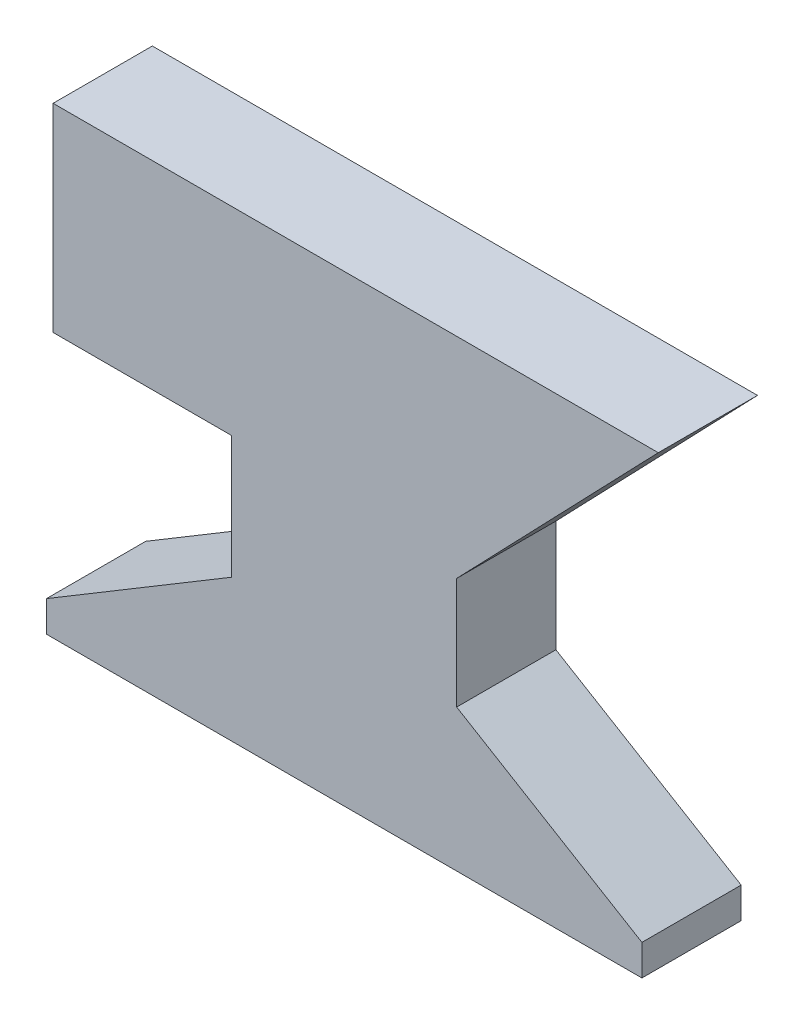
ISO-10303-21;
HEADER;
FILE_DESCRIPTION(('STEP AP214'),'2;1');
FILE_NAME('part.step','',(''),(''),'','','');
FILE_SCHEMA(('AUTOMOTIVE_DESIGN { 1 0 10303 214 1 1 1 1 }'));
ENDSEC;
DATA;
#1=APPLICATION_CONTEXT('core data for automotive mechanical design processes');
#2=APPLICATION_PROTOCOL_DEFINITION('international standard','automotive_design',2000,#1);
#3=PRODUCT_CONTEXT('',#1,'mechanical');
#4=PRODUCT('Part','Part','',(#3));
#5=PRODUCT_RELATED_PRODUCT_CATEGORY('part','',(#4));
#6=PRODUCT_DEFINITION_FORMATION('','',#4);
#7=PRODUCT_DEFINITION_CONTEXT('part definition',#1,'design');
#8=PRODUCT_DEFINITION('design','',#6,#7);
#9=PRODUCT_DEFINITION_SHAPE('','',#8);
#10=(LENGTH_UNIT() NAMED_UNIT(*) SI_UNIT(.MILLI.,.METRE.));
#11=(NAMED_UNIT(*) PLANE_ANGLE_UNIT() SI_UNIT($,.RADIAN.));
#12=(NAMED_UNIT(*) SI_UNIT($,.STERADIAN.) SOLID_ANGLE_UNIT());
#13=UNCERTAINTY_MEASURE_WITH_UNIT(LENGTH_MEASURE(1.E-05),#10,'distance_accuracy_value','');
#14=(GEOMETRIC_REPRESENTATION_CONTEXT(3) GLOBAL_UNCERTAINTY_ASSIGNED_CONTEXT((#13)) GLOBAL_UNIT_ASSIGNED_CONTEXT((#10,
#11,#12)) REPRESENTATION_CONTEXT('',''));
#15=CARTESIAN_POINT('',(0.,0.,0.));
#16=DIRECTION('',(0.,0.,1.));
#17=DIRECTION('',(1.,0.,0.));
#18=AXIS2_PLACEMENT_3D('',#15,#16,#17);
#19=CARTESIAN_POINT('',(-56.1282930687785,0.,5.));
#20=DIRECTION('',(0.,1.,0.));
#21=DIRECTION('',(-1.,0.,0.));
#22=AXIS2_PLACEMENT_3D('',#19,#20,#21);
#23=PLANE('',#22);
#24=DIRECTION('',(1.,0.,0.));
#25=VECTOR('',#24,1.);
#26=CARTESIAN_POINT('',(-56.1282930687785,0.,0.));
#27=LINE('',#26,#25);
#28=CARTESIAN_POINT('',(-101.128293068778,0.,0.));
#29=VERTEX_POINT('',#28);
#30=CARTESIAN_POINT('',(-56.1282930687785,0.,0.));
#31=VERTEX_POINT('',#30);
#32=EDGE_CURVE('E84',#29,#31,#27,.T.);
#33=ORIENTED_EDGE('',*,*,#32,.T.);
#34=DIRECTION('',(0.,0.,-1.));
#35=VECTOR('',#34,1.);
#36=CARTESIAN_POINT('',(-56.1282930687785,0.,5.));
#37=LINE('',#36,#35);
#38=CARTESIAN_POINT('',(-56.1282930687785,0.,5.));
#39=VERTEX_POINT('',#38);
#40=EDGE_CURVE('E12',#39,#31,#37,.T.);
#41=ORIENTED_EDGE('',*,*,#40,.F.);
#42=DIRECTION('',(1.,0.,0.));
#43=VECTOR('',#42,1.);
#44=CARTESIAN_POINT('',(-56.1282930687785,0.,5.));
#45=LINE('',#44,#43);
#46=CARTESIAN_POINT('',(-101.128293068778,0.,5.));
#47=VERTEX_POINT('',#46);
#48=EDGE_CURVE('E53',#47,#39,#45,.T.);
#49=ORIENTED_EDGE('',*,*,#48,.F.);
#50=DIRECTION('',(0.,0.,-1.));
#51=VECTOR('',#50,1.);
#52=CARTESIAN_POINT('',(-101.128293068778,0.,5.));
#53=LINE('',#52,#51);
#54=EDGE_CURVE('E45',#47,#29,#53,.T.);
#55=ORIENTED_EDGE('',*,*,#54,.T.);
#56=EDGE_LOOP('',(#33,#41,#49,#55));
#57=FACE_BOUND('',#56,.T.);
#58=ADVANCED_FACE('F37',(#57),#23,.F.);
#59=CARTESIAN_POINT('',(0.,0.,5.));
#60=DIRECTION('',(0.,0.,-1.));
#61=DIRECTION('',(-1.,0.,0.));
#62=AXIS2_PLACEMENT_3D('',#59,#60,#61);
#63=PLANE('',#62);
#64=DIRECTION('',(0.,1.,0.));
#65=VECTOR('',#64,1.);
#66=CARTESIAN_POINT('',(-101.128293068778,0.,5.));
#67=LINE('',#66,#65);
#68=CARTESIAN_POINT('',(-101.128293068778,2.33238075793813,5.));
#69=VERTEX_POINT('',#68);
#70=EDGE_CURVE('E111',#47,#69,#67,.T.);
#71=ORIENTED_EDGE('',*,*,#70,.F.);
#72=ORIENTED_EDGE('',*,*,#48,.T.);
#73=DIRECTION('',(0.,-1.,0.));
#74=VECTOR('',#73,1.);
#75=CARTESIAN_POINT('',(-56.1282930687785,2.33238075793813,5.));
#76=LINE('',#75,#74);
#77=CARTESIAN_POINT('',(-56.1282930687785,2.33238075793813,5.));
#78=VERTEX_POINT('',#77);
#79=EDGE_CURVE('E153',#78,#39,#76,.T.);
#80=ORIENTED_EDGE('',*,*,#79,.F.);
#81=DIRECTION('',(0.857492925712544,-0.514495755427527,0.));
#82=VECTOR('',#81,1.);
#83=CARTESIAN_POINT('',(-70.1282930687784,10.7323807579381,5.));
#84=LINE('',#83,#82);
#85=CARTESIAN_POINT('',(-70.1282930687784,10.7323807579381,5.));
#86=VERTEX_POINT('',#85);
#87=EDGE_CURVE('E149',#86,#78,#84,.T.);
#88=ORIENTED_EDGE('',*,*,#87,.F.);
#89=DIRECTION('',(0.,-1.,0.));
#90=VECTOR('',#89,1.);
#91=CARTESIAN_POINT('',(-70.1282930687784,19.1544497925006,5.));
#92=LINE('',#91,#90);
#93=CARTESIAN_POINT('',(-70.1282930687784,19.1544497925006,5.));
#94=VERTEX_POINT('',#93);
#95=EDGE_CURVE('E145',#94,#86,#92,.T.);
#96=ORIENTED_EDGE('',*,*,#95,.F.);
#97=DIRECTION('',(-0.693108716251785,-0.720833064901856,0.));
#98=VECTOR('',#97,1.);
#99=CARTESIAN_POINT('',(-54.892187100029,35.,5.));
#100=LINE('',#99,#98);
#101=CARTESIAN_POINT('',(-54.892187100029,35.,5.));
#102=VERTEX_POINT('',#101);
#103=EDGE_CURVE('E141',#102,#94,#100,.T.);
#104=ORIENTED_EDGE('',*,*,#103,.F.);
#105=DIRECTION('',(1.,0.,0.));
#106=VECTOR('',#105,1.);
#107=CARTESIAN_POINT('',(-54.892187100029,35.,5.));
#108=LINE('',#107,#106);
#109=CARTESIAN_POINT('',(-100.628293068778,35.,5.));
#110=VERTEX_POINT('',#109);
#111=EDGE_CURVE('E137',#110,#102,#108,.T.);
#112=ORIENTED_EDGE('',*,*,#111,.F.);
#113=DIRECTION('',(0.,1.,0.));
#114=VECTOR('',#113,1.);
#115=CARTESIAN_POINT('',(-100.628293068778,35.,5.));
#116=LINE('',#115,#114);
#117=CARTESIAN_POINT('',(-100.628293068778,20.,5.));
#118=VERTEX_POINT('',#117);
#119=EDGE_CURVE('E133',#118,#110,#116,.T.);
#120=ORIENTED_EDGE('',*,*,#119,.F.);
#121=DIRECTION('',(-1.,0.,0.));
#122=VECTOR('',#121,1.);
#123=CARTESIAN_POINT('',(-87.1282930687785,20.,5.));
#124=LINE('',#123,#122);
#125=CARTESIAN_POINT('',(-87.1282930687785,20.,5.));
#126=VERTEX_POINT('',#125);
#127=EDGE_CURVE('E129',#126,#118,#124,.T.);
#128=ORIENTED_EDGE('',*,*,#127,.F.);
#129=DIRECTION('',(0.,1.,0.));
#130=VECTOR('',#129,1.);
#131=CARTESIAN_POINT('',(-87.1282930687785,10.7323807579381,5.));
#132=LINE('',#131,#130);
#133=CARTESIAN_POINT('',(-87.1282930687785,10.7323807579381,5.));
#134=VERTEX_POINT('',#133);
#135=EDGE_CURVE('E125',#134,#126,#132,.T.);
#136=ORIENTED_EDGE('',*,*,#135,.F.);
#137=DIRECTION('',(0.857492925712544,0.514495755427527,0.));
#138=VECTOR('',#137,1.);
#139=CARTESIAN_POINT('',(-101.128293068778,2.33238075793813,5.));
#140=LINE('',#139,#138);
#141=EDGE_CURVE('E121',#69,#134,#140,.T.);
#142=ORIENTED_EDGE('',*,*,#141,.F.);
#143=EDGE_LOOP('',(#71,#72,#80,#88,#96,#104,#112,#120,#128,#136,#142));
#144=FACE_BOUND('',#143,.T.);
#145=ADVANCED_FACE('F280',(#144),#63,.F.);
#146=CARTESIAN_POINT('',(0.,0.,0.));
#147=DIRECTION('',(0.,0.,-1.));
#148=DIRECTION('',(-1.,0.,0.));
#149=AXIS2_PLACEMENT_3D('',#146,#147,#148);
#150=PLANE('',#149);
#151=ORIENTED_EDGE('',*,*,#32,.F.);
#152=DIRECTION('',(-0.857492925712544,-0.514495755427527,0.));
#153=VECTOR('',#152,1.);
#154=CARTESIAN_POINT('',(-101.128293068778,0.,0.));
#155=LINE('',#154,#153);
#156=CARTESIAN_POINT('',(-86.1282930687785,9.00000000000001,0.));
#157=VERTEX_POINT('',#156);
#158=EDGE_CURVE('E81',#157,#29,#155,.T.);
#159=ORIENTED_EDGE('',*,*,#158,.F.);
#160=DIRECTION('',(0.,-1.,0.));
#161=VECTOR('',#160,1.);
#162=CARTESIAN_POINT('',(-86.1282930687785,9.00000000000001,0.));
#163=LINE('',#162,#161);
#164=CARTESIAN_POINT('',(-86.1282930687785,21.,0.));
#165=VERTEX_POINT('',#164);
#166=EDGE_CURVE('E104',#165,#157,#163,.T.);
#167=ORIENTED_EDGE('',*,*,#166,.F.);
#168=DIRECTION('',(1.,0.,0.));
#169=VECTOR('',#168,1.);
#170=CARTESIAN_POINT('',(-86.1282930687785,21.,0.));
#171=LINE('',#170,#169);
#172=CARTESIAN_POINT('',(-98.6282930687785,21.,0.));
#173=VERTEX_POINT('',#172);
#174=EDGE_CURVE('E182',#173,#165,#171,.T.);
#175=ORIENTED_EDGE('',*,*,#174,.F.);
#176=DIRECTION('',(0.,-1.,0.));
#177=VECTOR('',#176,1.);
#178=CARTESIAN_POINT('',(-98.6282930687785,21.,0.));
#179=LINE('',#178,#177);
#180=CARTESIAN_POINT('',(-98.6282930687785,34.,0.));
#181=VERTEX_POINT('',#180);
#182=EDGE_CURVE('E179',#181,#173,#179,.T.);
#183=ORIENTED_EDGE('',*,*,#182,.F.);
#184=DIRECTION('',(-1.,0.,0.));
#185=VECTOR('',#184,1.);
#186=CARTESIAN_POINT('',(-98.6282930687785,34.,0.));
#187=LINE('',#186,#185);
#188=CARTESIAN_POINT('',(-58.6282930687785,34.,0.));
#189=VERTEX_POINT('',#188);
#190=EDGE_CURVE('E176',#189,#181,#187,.T.);
#191=ORIENTED_EDGE('',*,*,#190,.F.);
#192=DIRECTION('',(0.693108716251785,0.720833064901856,0.));
#193=VECTOR('',#192,1.);
#194=CARTESIAN_POINT('',(-58.6282930687785,34.,0.));
#195=LINE('',#194,#193);
#196=CARTESIAN_POINT('',(-71.1282930687785,21.,0.));
#197=VERTEX_POINT('',#196);
#198=EDGE_CURVE('E173',#197,#189,#195,.T.);
#199=ORIENTED_EDGE('',*,*,#198,.F.);
#200=DIRECTION('',(0.,1.,0.));
#201=VECTOR('',#200,1.);
#202=CARTESIAN_POINT('',(-71.1282930687785,21.,0.));
#203=LINE('',#202,#201);
#204=CARTESIAN_POINT('',(-71.1282930687784,9.00000000000001,0.));
#205=VERTEX_POINT('',#204);
#206=EDGE_CURVE('E170',#205,#197,#203,.T.);
#207=ORIENTED_EDGE('',*,*,#206,.F.);
#208=DIRECTION('',(-0.857492925712544,0.514495755427527,0.));
#209=VECTOR('',#208,1.);
#210=CARTESIAN_POINT('',(-71.1282930687784,9.00000000000001,0.));
#211=LINE('',#210,#209);
#212=EDGE_CURVE('E91',#31,#205,#211,.T.);
#213=ORIENTED_EDGE('',*,*,#212,.F.);
#214=EDGE_LOOP('',(#151,#159,#167,#175,#183,#191,#199,#207,#213));
#215=FACE_BOUND('',#214,.T.);
#216=ADVANCED_FACE('F89',(#215),#150,.T.);
#217=CARTESIAN_POINT('',(-58.6282930687785,34.,-62.9894602074673));
#218=DIRECTION('',(0.,1.,0.));
#219=DIRECTION('',(0.,0.,1.));
#220=AXIS2_PLACEMENT_3D('',#217,#218,#219);
#221=PLANE('',#220);
#222=ORIENTED_EDGE('',*,*,#190,.T.);
#223=DIRECTION('',(0.,0.,1.));
#224=VECTOR('',#223,1.);
#225=CARTESIAN_POINT('',(-98.6282930687785,34.,-62.9894602074673));
#226=LINE('',#225,#224);
#227=CARTESIAN_POINT('',(-98.6282930687785,34.,-2.50000000000002));
#228=VERTEX_POINT('',#227);
#229=EDGE_CURVE('E167',#228,#181,#226,.T.);
#230=ORIENTED_EDGE('',*,*,#229,.F.);
#231=DIRECTION('',(-1.,0.,0.));
#232=VECTOR('',#231,1.);
#233=CARTESIAN_POINT('',(-58.6282930687785,34.,-2.5));
#234=LINE('',#233,#232);
#235=CARTESIAN_POINT('',(-58.6282930687785,34.,-2.5));
#236=VERTEX_POINT('',#235);
#237=EDGE_CURVE('E211',#236,#228,#234,.T.);
#238=ORIENTED_EDGE('',*,*,#237,.F.);
#239=DIRECTION('',(0.,0.,1.));
#240=VECTOR('',#239,1.);
#241=CARTESIAN_POINT('',(-58.6282930687785,34.,-62.9894602074673));
#242=LINE('',#241,#240);
#243=EDGE_CURVE('E164',#236,#189,#242,.T.);
#244=ORIENTED_EDGE('',*,*,#243,.T.);
#245=EDGE_LOOP('',(#222,#230,#238,#244));
#246=FACE_BOUND('',#245,.T.);
#247=ADVANCED_FACE('F326',(#246),#221,.F.);
#248=CARTESIAN_POINT('',(-98.6282930687785,34.,-62.9894602074673));
#249=DIRECTION('',(-1.,0.,0.));
#250=DIRECTION('',(0.,0.,1.));
#251=AXIS2_PLACEMENT_3D('',#248,#249,#250);
#252=PLANE('',#251);
#253=ORIENTED_EDGE('',*,*,#182,.T.);
#254=DIRECTION('',(0.,0.,1.));
#255=VECTOR('',#254,1.);
#256=CARTESIAN_POINT('',(-98.6282930687785,21.,-62.9894602074673));
#257=LINE('',#256,#255);
#258=CARTESIAN_POINT('',(-98.6282930687785,21.,-2.50000000000002));
#259=VERTEX_POINT('',#258);
#260=EDGE_CURVE('E199',#259,#173,#257,.T.);
#261=ORIENTED_EDGE('',*,*,#260,.F.);
#262=DIRECTION('',(0.,-1.,0.));
#263=VECTOR('',#262,1.);
#264=CARTESIAN_POINT('',(-98.6282930687785,34.,-2.5));
#265=LINE('',#264,#263);
#266=EDGE_CURVE('E214',#228,#259,#265,.T.);
#267=ORIENTED_EDGE('',*,*,#266,.F.);
#268=ORIENTED_EDGE('',*,*,#229,.T.);
#269=EDGE_LOOP('',(#253,#261,#267,#268));
#270=FACE_BOUND('',#269,.T.);
#271=ADVANCED_FACE('F382',(#270),#252,.F.);
#272=CARTESIAN_POINT('',(-98.6282930687785,21.,-62.9894602074673));
#273=DIRECTION('',(0.,-1.,0.));
#274=DIRECTION('',(1.,0.,0.));
#275=AXIS2_PLACEMENT_3D('',#272,#273,#274);
#276=PLANE('',#275);
#277=ORIENTED_EDGE('',*,*,#174,.T.);
#278=DIRECTION('',(0.,0.,1.));
#279=VECTOR('',#278,1.);
#280=CARTESIAN_POINT('',(-86.1282930687785,21.,-62.9894602074673));
#281=LINE('',#280,#279);
#282=CARTESIAN_POINT('',(-86.1282930687785,21.,-2.50000000000002));
#283=VERTEX_POINT('',#282);
#284=EDGE_CURVE('E115',#283,#165,#281,.T.);
#285=ORIENTED_EDGE('',*,*,#284,.F.);
#286=DIRECTION('',(1.,0.,0.));
#287=VECTOR('',#286,1.);
#288=CARTESIAN_POINT('',(-98.6282930687785,21.,-2.5));
#289=LINE('',#288,#287);
#290=EDGE_CURVE('E201',#259,#283,#289,.T.);
#291=ORIENTED_EDGE('',*,*,#290,.F.);
#292=ORIENTED_EDGE('',*,*,#260,.T.);
#293=EDGE_LOOP('',(#277,#285,#291,#292));
#294=FACE_BOUND('',#293,.T.);
#295=ADVANCED_FACE('F194',(#294),#276,.F.);
#296=CARTESIAN_POINT('',(-86.1282930687785,21.,-62.9894602074673));
#297=DIRECTION('',(-1.,0.,0.));
#298=DIRECTION('',(0.,-1.,0.));
#299=AXIS2_PLACEMENT_3D('',#296,#297,#298);
#300=PLANE('',#299);
#301=ORIENTED_EDGE('',*,*,#166,.T.);
#302=DIRECTION('',(0.,0.,1.));
#303=VECTOR('',#302,1.);
#304=CARTESIAN_POINT('',(-86.1282930687785,9.00000000000001,-62.9894602074673));
#305=LINE('',#304,#303);
#306=CARTESIAN_POINT('',(-86.1282930687785,9.00000000000001,-2.50000000000002));
#307=VERTEX_POINT('',#306);
#308=EDGE_CURVE('E103',#307,#157,#305,.T.);
#309=ORIENTED_EDGE('',*,*,#308,.F.);
#310=DIRECTION('',(0.,-1.,0.));
#311=VECTOR('',#310,1.);
#312=CARTESIAN_POINT('',(-86.1282930687785,21.,-2.5));
#313=LINE('',#312,#311);
#314=EDGE_CURVE('E217',#283,#307,#313,.T.);
#315=ORIENTED_EDGE('',*,*,#314,.F.);
#316=ORIENTED_EDGE('',*,*,#284,.T.);
#317=EDGE_LOOP('',(#301,#309,#315,#316));
#318=FACE_BOUND('',#317,.T.);
#319=ADVANCED_FACE('F187',(#318),#300,.F.);
#320=CARTESIAN_POINT('',(-86.1282930687785,9.00000000000001,-62.9894602074673));
#321=DIRECTION('',(-0.514495755427527,0.857492925712544,0.));
#322=DIRECTION('',(-0.857492925712544,-0.514495755427527,0.));
#323=AXIS2_PLACEMENT_3D('',#320,#321,#322);
#324=PLANE('',#323);
#325=ORIENTED_EDGE('',*,*,#158,.T.);
#326=DIRECTION('',(0.,0.,1.));
#327=VECTOR('',#326,1.);
#328=CARTESIAN_POINT('',(-101.128293068778,0.,-62.9894602074673));
#329=LINE('',#328,#327);
#330=CARTESIAN_POINT('',(-101.128293068778,0.,-2.50000000000002));
#331=VERTEX_POINT('',#330);
#332=EDGE_CURVE('E100',#331,#29,#329,.T.);
#333=ORIENTED_EDGE('',*,*,#332,.F.);
#334=DIRECTION('',(-0.857492925712544,-0.514495755427527,0.));
#335=VECTOR('',#334,1.);
#336=CARTESIAN_POINT('',(-86.1282930687785,9.00000000000001,-2.5));
#337=LINE('',#336,#335);
#338=EDGE_CURVE('E219',#307,#331,#337,.T.);
#339=ORIENTED_EDGE('',*,*,#338,.F.);
#340=ORIENTED_EDGE('',*,*,#308,.T.);
#341=EDGE_LOOP('',(#325,#333,#339,#340));
#342=FACE_BOUND('',#341,.T.);
#343=ADVANCED_FACE('F97',(#342),#324,.F.);
#344=CARTESIAN_POINT('',(-101.128293068778,0.,-62.9894602074673));
#345=DIRECTION('',(1.,0.,0.));
#346=DIRECTION('',(0.,0.,-1.));
#347=AXIS2_PLACEMENT_3D('',#344,#345,#346);
#348=PLANE('',#347);
#349=DIRECTION('',(0.,1.,0.));
#350=VECTOR('',#349,1.);
#351=CARTESIAN_POINT('',(-101.128293068778,0.,-2.5));
#352=LINE('',#351,#350);
#353=CARTESIAN_POINT('',(-101.128293068778,2.33238075793813,-2.50000000000002));
#354=VERTEX_POINT('',#353);
#355=EDGE_CURVE('E110',#331,#354,#352,.T.);
#356=ORIENTED_EDGE('',*,*,#355,.F.);
#357=ORIENTED_EDGE('',*,*,#332,.T.);
#358=ORIENTED_EDGE('',*,*,#54,.F.);
#359=ORIENTED_EDGE('',*,*,#70,.T.);
#360=DIRECTION('',(0.,0.,1.));
#361=VECTOR('',#360,1.);
#362=CARTESIAN_POINT('',(-101.128293068778,2.33238075793813,-62.9894602074673));
#363=LINE('',#362,#361);
#364=EDGE_CURVE('E113',#354,#69,#363,.T.);
#365=ORIENTED_EDGE('',*,*,#364,.F.);
#366=EDGE_LOOP('',(#356,#357,#358,#359,#365));
#367=FACE_BOUND('',#366,.T.);
#368=ADVANCED_FACE('F107',(#367),#348,.F.);
#369=CARTESIAN_POINT('',(-101.128293068778,2.33238075793813,-62.9894602074673));
#370=DIRECTION('',(0.514495755427527,-0.857492925712544,0.));
#371=DIRECTION('',(0.857492925712544,0.514495755427527,0.));
#372=AXIS2_PLACEMENT_3D('',#369,#370,#371);
#373=PLANE('',#372);
#374=DIRECTION('',(0.857492925712544,0.514495755427527,0.));
#375=VECTOR('',#374,1.);
#376=CARTESIAN_POINT('',(-101.128293068778,2.33238075793813,-2.5));
#377=LINE('',#376,#375);
#378=CARTESIAN_POINT('',(-87.1282930687785,10.7323807579381,-2.50000000000002));
#379=VERTEX_POINT('',#378);
#380=EDGE_CURVE('E222',#354,#379,#377,.T.);
#381=ORIENTED_EDGE('',*,*,#380,.F.);
#382=ORIENTED_EDGE('',*,*,#364,.T.);
#383=ORIENTED_EDGE('',*,*,#141,.T.);
#384=DIRECTION('',(0.,0.,1.));
#385=VECTOR('',#384,1.);
#386=CARTESIAN_POINT('',(-87.1282930687785,10.7323807579381,-62.9894602074673));
#387=LINE('',#386,#385);
#388=EDGE_CURVE('E122',#379,#134,#387,.T.);
#389=ORIENTED_EDGE('',*,*,#388,.F.);
#390=EDGE_LOOP('',(#381,#382,#383,#389));
#391=FACE_BOUND('',#390,.T.);
#392=ADVANCED_FACE('F381',(#391),#373,.F.);
#393=CARTESIAN_POINT('',(-87.1282930687785,10.7323807579381,-62.9894602074673));
#394=DIRECTION('',(1.,0.,0.));
#395=DIRECTION('',(0.,0.,-1.));
#396=AXIS2_PLACEMENT_3D('',#393,#394,#395);
#397=PLANE('',#396);
#398=DIRECTION('',(0.,1.,0.));
#399=VECTOR('',#398,1.);
#400=CARTESIAN_POINT('',(-87.1282930687785,10.7323807579381,-2.5));
#401=LINE('',#400,#399);
#402=CARTESIAN_POINT('',(-87.1282930687785,20.,-2.50000000000002));
#403=VERTEX_POINT('',#402);
#404=EDGE_CURVE('E225',#379,#403,#401,.T.);
#405=ORIENTED_EDGE('',*,*,#404,.F.);
#406=ORIENTED_EDGE('',*,*,#388,.T.);
#407=ORIENTED_EDGE('',*,*,#135,.T.);
#408=DIRECTION('',(0.,0.,1.));
#409=VECTOR('',#408,1.);
#410=CARTESIAN_POINT('',(-87.1282930687785,20.,-62.9894602074673));
#411=LINE('',#410,#409);
#412=EDGE_CURVE('E126',#403,#126,#411,.T.);
#413=ORIENTED_EDGE('',*,*,#412,.F.);
#414=EDGE_LOOP('',(#405,#406,#407,#413));
#415=FACE_BOUND('',#414,.T.);
#416=ADVANCED_FACE('F377',(#415),#397,.F.);
#417=CARTESIAN_POINT('',(-87.1282930687785,20.,-62.9894602074673));
#418=DIRECTION('',(0.,1.,0.));
#419=DIRECTION('',(0.,0.,1.));
#420=AXIS2_PLACEMENT_3D('',#417,#418,#419);
#421=PLANE('',#420);
#422=DIRECTION('',(-1.,0.,0.));
#423=VECTOR('',#422,1.);
#424=CARTESIAN_POINT('',(-87.1282930687785,20.,-2.5));
#425=LINE('',#424,#423);
#426=CARTESIAN_POINT('',(-100.628293068778,20.,-2.50000000000002));
#427=VERTEX_POINT('',#426);
#428=EDGE_CURVE('E228',#403,#427,#425,.T.);
#429=ORIENTED_EDGE('',*,*,#428,.F.);
#430=ORIENTED_EDGE('',*,*,#412,.T.);
#431=ORIENTED_EDGE('',*,*,#127,.T.);
#432=DIRECTION('',(0.,0.,1.));
#433=VECTOR('',#432,1.);
#434=CARTESIAN_POINT('',(-100.628293068778,20.,-62.9894602074673));
#435=LINE('',#434,#433);
#436=EDGE_CURVE('E130',#427,#118,#435,.T.);
#437=ORIENTED_EDGE('',*,*,#436,.F.);
#438=EDGE_LOOP('',(#429,#430,#431,#437));
#439=FACE_BOUND('',#438,.T.);
#440=ADVANCED_FACE('F374',(#439),#421,.F.);
#441=CARTESIAN_POINT('',(-100.628293068778,35.,-62.9894602074673));
#442=DIRECTION('',(1.,0.,0.));
#443=DIRECTION('',(0.,0.,-1.));
#444=AXIS2_PLACEMENT_3D('',#441,#442,#443);
#445=PLANE('',#444);
#446=DIRECTION('',(0.,1.,0.));
#447=VECTOR('',#446,1.);
#448=CARTESIAN_POINT('',(-100.628293068778,35.,-2.5));
#449=LINE('',#448,#447);
#450=CARTESIAN_POINT('',(-100.628293068778,35.,-2.50000000000002));
#451=VERTEX_POINT('',#450);
#452=EDGE_CURVE('E231',#427,#451,#449,.T.);
#453=ORIENTED_EDGE('',*,*,#452,.F.);
#454=ORIENTED_EDGE('',*,*,#436,.T.);
#455=ORIENTED_EDGE('',*,*,#119,.T.);
#456=DIRECTION('',(0.,0.,1.));
#457=VECTOR('',#456,1.);
#458=CARTESIAN_POINT('',(-100.628293068778,35.,-62.9894602074673));
#459=LINE('',#458,#457);
#460=EDGE_CURVE('E134',#451,#110,#459,.T.);
#461=ORIENTED_EDGE('',*,*,#460,.F.);
#462=EDGE_LOOP('',(#453,#454,#455,#461));
#463=FACE_BOUND('',#462,.T.);
#464=ADVANCED_FACE('F425',(#463),#445,.F.);
#465=CARTESIAN_POINT('',(-54.892187100029,35.,-62.9894602074673));
#466=DIRECTION('',(0.,-1.,0.));
#467=DIRECTION('',(0.,0.,-1.));
#468=AXIS2_PLACEMENT_3D('',#465,#466,#467);
#469=PLANE('',#468);
#470=DIRECTION('',(1.,0.,0.));
#471=VECTOR('',#470,1.);
#472=CARTESIAN_POINT('',(-54.892187100029,35.,-2.5));
#473=LINE('',#472,#471);
#474=CARTESIAN_POINT('',(-54.892187100029,35.,-2.50000000000002));
#475=VERTEX_POINT('',#474);
#476=EDGE_CURVE('E234',#451,#475,#473,.T.);
#477=ORIENTED_EDGE('',*,*,#476,.F.);
#478=ORIENTED_EDGE('',*,*,#460,.T.);
#479=ORIENTED_EDGE('',*,*,#111,.T.);
#480=DIRECTION('',(0.,0.,1.));
#481=VECTOR('',#480,1.);
#482=CARTESIAN_POINT('',(-54.892187100029,35.,-62.9894602074673));
#483=LINE('',#482,#481);
#484=EDGE_CURVE('E138',#475,#102,#483,.T.);
#485=ORIENTED_EDGE('',*,*,#484,.F.);
#486=EDGE_LOOP('',(#477,#478,#479,#485));
#487=FACE_BOUND('',#486,.T.);
#488=ADVANCED_FACE('F364',(#487),#469,.F.);
#489=CARTESIAN_POINT('',(-54.892187100029,35.,-62.9894602074673));
#490=DIRECTION('',(-0.720833064901856,0.693108716251785,0.));
#491=DIRECTION('',(-0.693108716251785,-0.720833064901856,0.));
#492=AXIS2_PLACEMENT_3D('',#489,#490,#491);
#493=PLANE('',#492);
#494=DIRECTION('',(-0.693108716251785,-0.720833064901856,0.));
#495=VECTOR('',#494,1.);
#496=CARTESIAN_POINT('',(-54.892187100029,35.,-2.5));
#497=LINE('',#496,#495);
#498=CARTESIAN_POINT('',(-70.1282930687784,19.1544497925006,-2.50000000000002));
#499=VERTEX_POINT('',#498);
#500=EDGE_CURVE('E237',#475,#499,#497,.T.);
#501=ORIENTED_EDGE('',*,*,#500,.F.);
#502=ORIENTED_EDGE('',*,*,#484,.T.);
#503=ORIENTED_EDGE('',*,*,#103,.T.);
#504=DIRECTION('',(0.,0.,1.));
#505=VECTOR('',#504,1.);
#506=CARTESIAN_POINT('',(-70.1282930687784,19.1544497925006,-62.9894602074673));
#507=LINE('',#506,#505);
#508=EDGE_CURVE('E142',#499,#94,#507,.T.);
#509=ORIENTED_EDGE('',*,*,#508,.F.);
#510=EDGE_LOOP('',(#501,#502,#503,#509));
#511=FACE_BOUND('',#510,.T.);
#512=ADVANCED_FACE('F362',(#511),#493,.F.);
#513=CARTESIAN_POINT('',(-70.1282930687784,19.1544497925006,-62.9894602074673));
#514=DIRECTION('',(-1.,0.,0.));
#515=DIRECTION('',(0.,0.,1.));
#516=AXIS2_PLACEMENT_3D('',#513,#514,#515);
#517=PLANE('',#516);
#518=DIRECTION('',(0.,-1.,0.));
#519=VECTOR('',#518,1.);
#520=CARTESIAN_POINT('',(-70.1282930687784,19.1544497925006,-2.5));
#521=LINE('',#520,#519);
#522=CARTESIAN_POINT('',(-70.1282930687784,10.7323807579381,-2.50000000000002));
#523=VERTEX_POINT('',#522);
#524=EDGE_CURVE('E240',#499,#523,#521,.T.);
#525=ORIENTED_EDGE('',*,*,#524,.F.);
#526=ORIENTED_EDGE('',*,*,#508,.T.);
#527=ORIENTED_EDGE('',*,*,#95,.T.);
#528=DIRECTION('',(0.,0.,1.));
#529=VECTOR('',#528,1.);
#530=CARTESIAN_POINT('',(-70.1282930687784,10.7323807579381,-62.9894602074673));
#531=LINE('',#530,#529);
#532=EDGE_CURVE('E146',#523,#86,#531,.T.);
#533=ORIENTED_EDGE('',*,*,#532,.F.);
#534=EDGE_LOOP('',(#525,#526,#527,#533));
#535=FACE_BOUND('',#534,.T.);
#536=ADVANCED_FACE('F358',(#535),#517,.F.);
#537=CARTESIAN_POINT('',(-70.1282930687784,10.7323807579381,-62.9894602074673));
#538=DIRECTION('',(-0.514495755427527,-0.857492925712544,0.));
#539=DIRECTION('',(0.857492925712544,-0.514495755427527,0.));
#540=AXIS2_PLACEMENT_3D('',#537,#538,#539);
#541=PLANE('',#540);
#542=DIRECTION('',(0.857492925712544,-0.514495755427527,0.));
#543=VECTOR('',#542,1.);
#544=CARTESIAN_POINT('',(-70.1282930687784,10.7323807579381,-2.5));
#545=LINE('',#544,#543);
#546=CARTESIAN_POINT('',(-56.1282930687785,2.33238075793813,-2.50000000000002));
#547=VERTEX_POINT('',#546);
#548=EDGE_CURVE('E243',#523,#547,#545,.T.);
#549=ORIENTED_EDGE('',*,*,#548,.F.);
#550=ORIENTED_EDGE('',*,*,#532,.T.);
#551=ORIENTED_EDGE('',*,*,#87,.T.);
#552=DIRECTION('',(0.,0.,1.));
#553=VECTOR('',#552,1.);
#554=CARTESIAN_POINT('',(-56.1282930687785,2.33238075793813,-62.9894602074673));
#555=LINE('',#554,#553);
#556=EDGE_CURVE('E150',#547,#78,#555,.T.);
#557=ORIENTED_EDGE('',*,*,#556,.F.);
#558=EDGE_LOOP('',(#549,#550,#551,#557));
#559=FACE_BOUND('',#558,.T.);
#560=ADVANCED_FACE('F356',(#559),#541,.F.);
#561=CARTESIAN_POINT('',(-56.1282930687785,2.33238075793813,-62.9894602074673));
#562=DIRECTION('',(-1.,0.,0.));
#563=DIRECTION('',(0.,0.,1.));
#564=AXIS2_PLACEMENT_3D('',#561,#562,#563);
#565=PLANE('',#564);
#566=DIRECTION('',(0.,-1.,0.));
#567=VECTOR('',#566,1.);
#568=CARTESIAN_POINT('',(-56.1282930687785,2.33238075793813,-2.5));
#569=LINE('',#568,#567);
#570=CARTESIAN_POINT('',(-56.1282930687785,0.,-2.50000000000002));
#571=VERTEX_POINT('',#570);
#572=EDGE_CURVE('E246',#547,#571,#569,.T.);
#573=ORIENTED_EDGE('',*,*,#572,.F.);
#574=ORIENTED_EDGE('',*,*,#556,.T.);
#575=ORIENTED_EDGE('',*,*,#79,.T.);
#576=ORIENTED_EDGE('',*,*,#40,.T.);
#577=DIRECTION('',(0.,0.,1.));
#578=VECTOR('',#577,1.);
#579=CARTESIAN_POINT('',(-56.1282930687785,0.,-62.9894602074673));
#580=LINE('',#579,#578);
#581=EDGE_CURVE('E154',#571,#31,#580,.T.);
#582=ORIENTED_EDGE('',*,*,#581,.F.);
#583=EDGE_LOOP('',(#573,#574,#575,#576,#582));
#584=FACE_BOUND('',#583,.T.);
#585=ADVANCED_FACE('F274',(#584),#565,.F.);
#586=CARTESIAN_POINT('',(-56.1282930687785,0.,-62.9894602074673));
#587=DIRECTION('',(0.514495755427527,0.857492925712544,0.));
#588=DIRECTION('',(-0.857492925712544,0.514495755427527,0.));
#589=AXIS2_PLACEMENT_3D('',#586,#587,#588);
#590=PLANE('',#589);
#591=ORIENTED_EDGE('',*,*,#212,.T.);
#592=DIRECTION('',(0.,0.,1.));
#593=VECTOR('',#592,1.);
#594=CARTESIAN_POINT('',(-71.1282930687784,9.00000000000001,-62.9894602074673));
#595=LINE('',#594,#593);
#596=CARTESIAN_POINT('',(-71.1282930687784,9.00000000000001,-2.50000000000002));
#597=VERTEX_POINT('',#596);
#598=EDGE_CURVE('E157',#597,#205,#595,.T.);
#599=ORIENTED_EDGE('',*,*,#598,.F.);
#600=DIRECTION('',(-0.857492925712544,0.514495755427527,0.));
#601=VECTOR('',#600,1.);
#602=CARTESIAN_POINT('',(-56.1282930687785,0.,-2.5));
#603=LINE('',#602,#601);
#604=EDGE_CURVE('E249',#571,#597,#603,.T.);
#605=ORIENTED_EDGE('',*,*,#604,.F.);
#606=ORIENTED_EDGE('',*,*,#581,.T.);
#607=EDGE_LOOP('',(#591,#599,#605,#606));
#608=FACE_BOUND('',#607,.T.);
#609=ADVANCED_FACE('F409',(#608),#590,.F.);
#610=CARTESIAN_POINT('',(-71.1282930687784,9.00000000000001,-62.9894602074673));
#611=DIRECTION('',(1.,0.,0.));
#612=DIRECTION('',(0.,1.,0.));
#613=AXIS2_PLACEMENT_3D('',#610,#611,#612);
#614=PLANE('',#613);
#615=ORIENTED_EDGE('',*,*,#206,.T.);
#616=DIRECTION('',(0.,0.,1.));
#617=VECTOR('',#616,1.);
#618=CARTESIAN_POINT('',(-71.1282930687785,21.,-62.9894602074673));
#619=LINE('',#618,#617);
#620=CARTESIAN_POINT('',(-71.1282930687785,21.,-2.50000000000002));
#621=VERTEX_POINT('',#620);
#622=EDGE_CURVE('E160',#621,#197,#619,.T.);
#623=ORIENTED_EDGE('',*,*,#622,.F.);
#624=DIRECTION('',(0.,1.,0.));
#625=VECTOR('',#624,1.);
#626=CARTESIAN_POINT('',(-71.1282930687784,9.00000000000001,-2.5));
#627=LINE('',#626,#625);
#628=EDGE_CURVE('E92',#597,#621,#627,.T.);
#629=ORIENTED_EDGE('',*,*,#628,.F.);
#630=ORIENTED_EDGE('',*,*,#598,.T.);
#631=EDGE_LOOP('',(#615,#623,#629,#630));
#632=FACE_BOUND('',#631,.T.);
#633=ADVANCED_FACE('F404',(#632),#614,.F.);
#634=CARTESIAN_POINT('',(-71.1282930687785,21.,-62.9894602074673));
#635=DIRECTION('',(0.720833064901856,-0.693108716251785,0.));
#636=DIRECTION('',(0.693108716251785,0.720833064901856,0.));
#637=AXIS2_PLACEMENT_3D('',#634,#635,#636);
#638=PLANE('',#637);
#639=ORIENTED_EDGE('',*,*,#198,.T.);
#640=ORIENTED_EDGE('',*,*,#243,.F.);
#641=DIRECTION('',(0.693108716251785,0.720833064901856,0.));
#642=VECTOR('',#641,1.);
#643=CARTESIAN_POINT('',(-71.1282930687785,21.,-2.5));
#644=LINE('',#643,#642);
#645=EDGE_CURVE('E163',#621,#236,#644,.T.);
#646=ORIENTED_EDGE('',*,*,#645,.F.);
#647=ORIENTED_EDGE('',*,*,#622,.T.);
#648=EDGE_LOOP('',(#639,#640,#646,#647));
#649=FACE_BOUND('',#648,.T.);
#650=ADVANCED_FACE('F322',(#649),#638,.F.);
#651=CARTESIAN_POINT('',(0.,0.,-2.5));
#652=DIRECTION('',(0.,0.,-1.));
#653=DIRECTION('',(-1.,0.,0.));
#654=AXIS2_PLACEMENT_3D('',#651,#652,#653);
#655=PLANE('',#654);
#656=ORIENTED_EDGE('',*,*,#645,.T.);
#657=ORIENTED_EDGE('',*,*,#237,.T.);
#658=ORIENTED_EDGE('',*,*,#266,.T.);
#659=ORIENTED_EDGE('',*,*,#290,.T.);
#660=ORIENTED_EDGE('',*,*,#314,.T.);
#661=ORIENTED_EDGE('',*,*,#338,.T.);
#662=ORIENTED_EDGE('',*,*,#355,.T.);
#663=ORIENTED_EDGE('',*,*,#380,.T.);
#664=ORIENTED_EDGE('',*,*,#404,.T.);
#665=ORIENTED_EDGE('',*,*,#428,.T.);
#666=ORIENTED_EDGE('',*,*,#452,.T.);
#667=ORIENTED_EDGE('',*,*,#476,.T.);
#668=ORIENTED_EDGE('',*,*,#500,.T.);
#669=ORIENTED_EDGE('',*,*,#524,.T.);
#670=ORIENTED_EDGE('',*,*,#548,.T.);
#671=ORIENTED_EDGE('',*,*,#572,.T.);
#672=ORIENTED_EDGE('',*,*,#604,.T.);
#673=ORIENTED_EDGE('',*,*,#628,.T.);
#674=EDGE_LOOP('',(#656,#657,#658,#659,#660,#661,#662,#663,#664,#665,#666,#667,#668,#669,#670,
#671,#672,#673));
#675=FACE_BOUND('',#674,.T.);
#676=ADVANCED_FACE('F329',(#675),#655,.T.);
#677=CLOSED_SHELL('',(#58,#145,#216,#247,#271,#295,#319,#343,#368,#392,#416,#440,#464,#488,#512,
#536,#560,#585,#609,#633,#650,#676));
#678=MANIFOLD_SOLID_BREP('B2',#677);
#679=ADVANCED_BREP_SHAPE_REPRESENTATION('',(#18,#678),#14);
#680=SHAPE_DEFINITION_REPRESENTATION(#9,#679);
ENDSEC;
END-ISO-10303-21;
